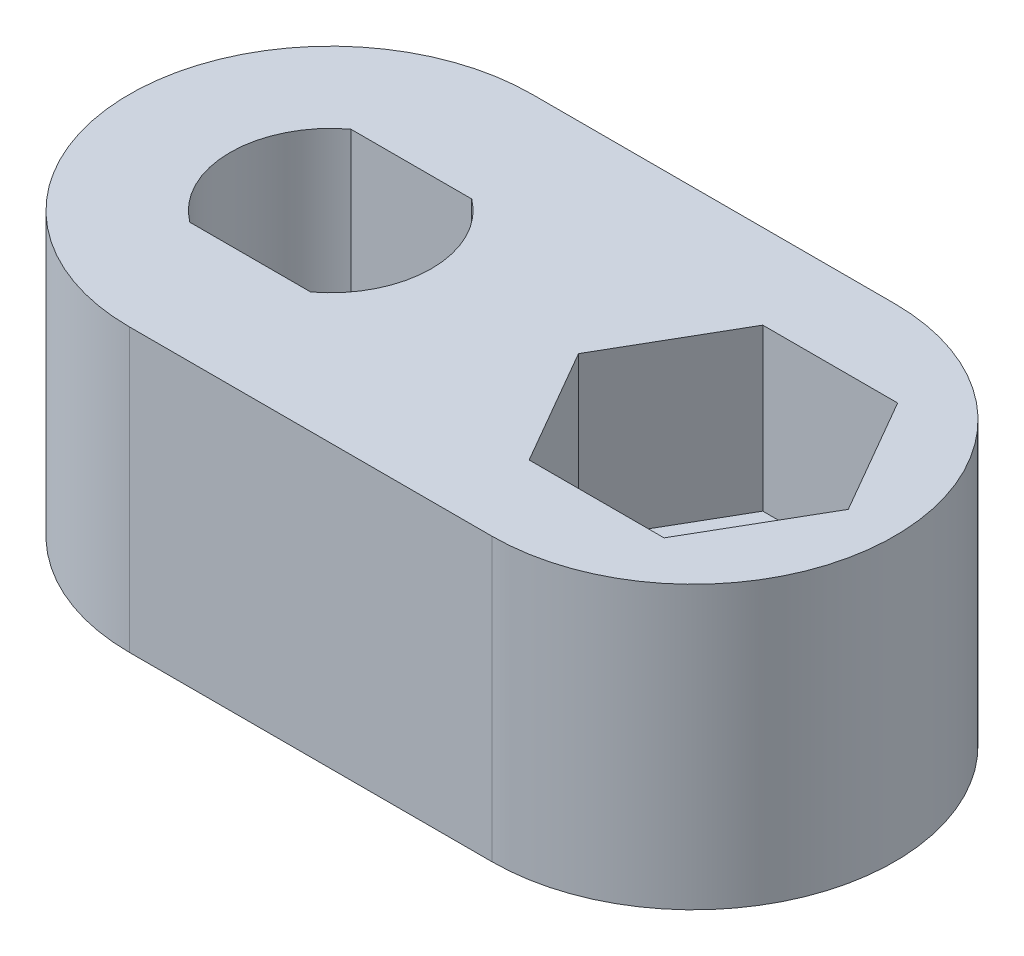
ISO-10303-21;
HEADER;
FILE_DESCRIPTION(('STEP AP214'),'2;1');
FILE_NAME('part.step','',(''),(''),'','','');
FILE_SCHEMA(('AUTOMOTIVE_DESIGN { 1 0 10303 214 1 1 1 1 }'));
ENDSEC;
DATA;
#1=APPLICATION_CONTEXT('core data for automotive mechanical design processes');
#2=APPLICATION_PROTOCOL_DEFINITION('international standard','automotive_design',2000,#1);
#3=PRODUCT_CONTEXT('',#1,'mechanical');
#4=PRODUCT('Part','Part','',(#3));
#5=PRODUCT_RELATED_PRODUCT_CATEGORY('part','',(#4));
#6=PRODUCT_DEFINITION_FORMATION('','',#4);
#7=PRODUCT_DEFINITION_CONTEXT('part definition',#1,'design');
#8=PRODUCT_DEFINITION('design','',#6,#7);
#9=PRODUCT_DEFINITION_SHAPE('','',#8);
#10=(LENGTH_UNIT() NAMED_UNIT(*) SI_UNIT(.MILLI.,.METRE.));
#11=(NAMED_UNIT(*) PLANE_ANGLE_UNIT() SI_UNIT($,.RADIAN.));
#12=(NAMED_UNIT(*) SI_UNIT($,.STERADIAN.) SOLID_ANGLE_UNIT());
#13=UNCERTAINTY_MEASURE_WITH_UNIT(LENGTH_MEASURE(1.E-05),#10,'distance_accuracy_value','');
#14=(GEOMETRIC_REPRESENTATION_CONTEXT(3) GLOBAL_UNCERTAINTY_ASSIGNED_CONTEXT((#13)) GLOBAL_UNIT_ASSIGNED_CONTEXT((#10,
#11,#12)) REPRESENTATION_CONTEXT('',''));
#15=CARTESIAN_POINT('',(0.,0.,0.));
#16=DIRECTION('',(0.,0.,1.));
#17=DIRECTION('',(1.,0.,0.));
#18=AXIS2_PLACEMENT_3D('',#15,#16,#17);
#19=CARTESIAN_POINT('',(5.,7.,0.));
#20=DIRECTION('',(0.,1.,0.));
#21=DIRECTION('',(0.,0.,1.));
#22=AXIS2_PLACEMENT_3D('',#19,#20,#21);
#23=CYLINDRICAL_SURFACE('',#22,2.07500000000001);
#24=CARTESIAN_POINT('',(5.,0.,0.));
#25=DIRECTION('',(0.,1.,0.));
#26=DIRECTION('',(0.,0.,1.));
#27=AXIS2_PLACEMENT_3D('',#24,#25,#26);
#28=CIRCLE('',#27,2.07500000000001);
#29=CARTESIAN_POINT('',(5.,0.,2.07500000000001));
#30=VERTEX_POINT('',#29);
#31=EDGE_CURVE('E216',#30,#30,#28,.T.);
#32=ORIENTED_EDGE('',*,*,#31,.F.);
#33=EDGE_LOOP('',(#32));
#34=FACE_BOUND('',#33,.T.);
#35=CARTESIAN_POINT('',(5.,3.,0.));
#36=DIRECTION('',(0.,1.,0.));
#37=DIRECTION('',(0.,0.,1.));
#38=AXIS2_PLACEMENT_3D('',#35,#36,#37);
#39=CIRCLE('',#38,2.07500000000001);
#40=CARTESIAN_POINT('',(5.,3.,2.07500000000001));
#41=VERTEX_POINT('',#40);
#42=EDGE_CURVE('E43',#41,#41,#39,.F.);
#43=ORIENTED_EDGE('',*,*,#42,.F.);
#44=EDGE_LOOP('',(#43));
#45=FACE_BOUND('',#44,.T.);
#46=ADVANCED_FACE('F39',(#34,#45),#23,.F.);
#47=CARTESIAN_POINT('',(-4.5,7.,0.));
#48=DIRECTION('',(0.,-1.,0.));
#49=DIRECTION('',(0.,0.,-1.));
#50=AXIS2_PLACEMENT_3D('',#47,#48,#49);
#51=CYLINDRICAL_SURFACE('',#50,5.);
#52=CARTESIAN_POINT('',(-4.5,0.,0.));
#53=DIRECTION('',(0.,1.,0.));
#54=DIRECTION('',(0.,0.,1.));
#55=AXIS2_PLACEMENT_3D('',#52,#53,#54);
#56=CIRCLE('',#55,5.);
#57=CARTESIAN_POINT('',(-4.5,0.,-5.));
#58=VERTEX_POINT('',#57);
#59=CARTESIAN_POINT('',(-4.5,0.,5.));
#60=VERTEX_POINT('',#59);
#61=EDGE_CURVE('E256',#58,#60,#56,.T.);
#62=ORIENTED_EDGE('',*,*,#61,.T.);
#63=DIRECTION('',(0.,-1.,0.));
#64=VECTOR('',#63,1.);
#65=CARTESIAN_POINT('',(-4.5,7.,5.));
#66=LINE('',#65,#64);
#67=CARTESIAN_POINT('',(-4.5,7.,5.));
#68=VERTEX_POINT('',#67);
#69=EDGE_CURVE('E11',#68,#60,#66,.T.);
#70=ORIENTED_EDGE('',*,*,#69,.F.);
#71=CARTESIAN_POINT('',(-4.5,7.,0.));
#72=DIRECTION('',(0.,1.,0.));
#73=DIRECTION('',(0.,0.,1.));
#74=AXIS2_PLACEMENT_3D('',#71,#72,#73);
#75=CIRCLE('',#74,5.);
#76=CARTESIAN_POINT('',(-4.5,7.,-5.));
#77=VERTEX_POINT('',#76);
#78=EDGE_CURVE('E265',#77,#68,#75,.T.);
#79=ORIENTED_EDGE('',*,*,#78,.F.);
#80=DIRECTION('',(0.,-1.,0.));
#81=VECTOR('',#80,1.);
#82=CARTESIAN_POINT('',(-4.5,7.,-5.));
#83=LINE('',#82,#81);
#84=EDGE_CURVE('E279',#77,#58,#83,.T.);
#85=ORIENTED_EDGE('',*,*,#84,.T.);
#86=EDGE_LOOP('',(#62,#70,#79,#85));
#87=FACE_BOUND('',#86,.T.);
#88=ADVANCED_FACE('F41',(#87),#51,.T.);
#89=CARTESIAN_POINT('',(-4.5,7.,5.));
#90=DIRECTION('',(0.,0.,-1.));
#91=DIRECTION('',(-1.,0.,0.));
#92=AXIS2_PLACEMENT_3D('',#89,#90,#91);
#93=PLANE('',#92);
#94=DIRECTION('',(1.,0.,0.));
#95=VECTOR('',#94,1.);
#96=CARTESIAN_POINT('',(-4.5,0.,5.));
#97=LINE('',#96,#95);
#98=CARTESIAN_POINT('',(4.5,0.,5.));
#99=VERTEX_POINT('',#98);
#100=EDGE_CURVE('E283',#60,#99,#97,.T.);
#101=ORIENTED_EDGE('',*,*,#100,.T.);
#102=DIRECTION('',(0.,-1.,0.));
#103=VECTOR('',#102,1.);
#104=CARTESIAN_POINT('',(4.5,7.,5.));
#105=LINE('',#104,#103);
#106=CARTESIAN_POINT('',(4.5,7.,5.));
#107=VERTEX_POINT('',#106);
#108=EDGE_CURVE('E49',#107,#99,#105,.T.);
#109=ORIENTED_EDGE('',*,*,#108,.F.);
#110=DIRECTION('',(1.,0.,0.));
#111=VECTOR('',#110,1.);
#112=CARTESIAN_POINT('',(-4.5,7.,5.));
#113=LINE('',#112,#111);
#114=EDGE_CURVE('E269',#68,#107,#113,.T.);
#115=ORIENTED_EDGE('',*,*,#114,.F.);
#116=ORIENTED_EDGE('',*,*,#69,.T.);
#117=EDGE_LOOP('',(#101,#109,#115,#116));
#118=FACE_BOUND('',#117,.T.);
#119=ADVANCED_FACE('F347',(#118),#93,.F.);
#120=CARTESIAN_POINT('',(4.5,7.,0.));
#121=DIRECTION('',(0.,-1.,0.));
#122=DIRECTION('',(0.,0.,-1.));
#123=AXIS2_PLACEMENT_3D('',#120,#121,#122);
#124=CYLINDRICAL_SURFACE('',#123,5.);
#125=CARTESIAN_POINT('',(4.5,0.,0.));
#126=DIRECTION('',(0.,1.,0.));
#127=DIRECTION('',(0.,0.,1.));
#128=AXIS2_PLACEMENT_3D('',#125,#126,#127);
#129=CIRCLE('',#128,5.);
#130=CARTESIAN_POINT('',(4.5,0.,-5.));
#131=VERTEX_POINT('',#130);
#132=EDGE_CURVE('E286',#99,#131,#129,.T.);
#133=ORIENTED_EDGE('',*,*,#132,.T.);
#134=DIRECTION('',(0.,-1.,0.));
#135=VECTOR('',#134,1.);
#136=CARTESIAN_POINT('',(4.5,7.,-5.));
#137=LINE('',#136,#135);
#138=CARTESIAN_POINT('',(4.5,7.,-5.));
#139=VERTEX_POINT('',#138);
#140=EDGE_CURVE('E294',#139,#131,#137,.T.);
#141=ORIENTED_EDGE('',*,*,#140,.F.);
#142=CARTESIAN_POINT('',(4.5,7.,0.));
#143=DIRECTION('',(0.,1.,0.));
#144=DIRECTION('',(0.,0.,1.));
#145=AXIS2_PLACEMENT_3D('',#142,#143,#144);
#146=CIRCLE('',#145,5.);
#147=EDGE_CURVE('E273',#107,#139,#146,.T.);
#148=ORIENTED_EDGE('',*,*,#147,.F.);
#149=ORIENTED_EDGE('',*,*,#108,.T.);
#150=EDGE_LOOP('',(#133,#141,#148,#149));
#151=FACE_BOUND('',#150,.T.);
#152=ADVANCED_FACE('F480',(#151),#124,.T.);
#153=CARTESIAN_POINT('',(-4.5,7.,-5.));
#154=DIRECTION('',(0.,0.,1.));
#155=DIRECTION('',(1.,0.,0.));
#156=AXIS2_PLACEMENT_3D('',#153,#154,#155);
#157=PLANE('',#156);
#158=DIRECTION('',(-1.,0.,0.));
#159=VECTOR('',#158,1.);
#160=CARTESIAN_POINT('',(-4.5,0.,-5.));
#161=LINE('',#160,#159);
#162=EDGE_CURVE('E270',#131,#58,#161,.T.);
#163=ORIENTED_EDGE('',*,*,#162,.T.);
#164=ORIENTED_EDGE('',*,*,#84,.F.);
#165=DIRECTION('',(-1.,0.,0.));
#166=VECTOR('',#165,1.);
#167=CARTESIAN_POINT('',(-4.5,7.,-5.));
#168=LINE('',#167,#166);
#169=EDGE_CURVE('E276',#139,#77,#168,.T.);
#170=ORIENTED_EDGE('',*,*,#169,.F.);
#171=ORIENTED_EDGE('',*,*,#140,.T.);
#172=EDGE_LOOP('',(#163,#164,#170,#171));
#173=FACE_BOUND('',#172,.T.);
#174=ADVANCED_FACE('F475',(#173),#157,.F.);
#175=CARTESIAN_POINT('',(-4.5,7.,0.));
#176=DIRECTION('',(0.,1.,0.));
#177=DIRECTION('',(0.,0.,1.));
#178=AXIS2_PLACEMENT_3D('',#175,#176,#177);
#179=PLANE('',#178);
#180=DIRECTION('',(0.5,0.,-0.866025403784439));
#181=VECTOR('',#180,1.);
#182=CARTESIAN_POINT('',(6.67431578064991,7.,2.89999999999999));
#183=LINE('',#182,#181);
#184=CARTESIAN_POINT('',(6.67431578064991,7.,2.89999999999999));
#185=VERTEX_POINT('',#184);
#186=CARTESIAN_POINT('',(8.34863156129982,7.,0.));
#187=VERTEX_POINT('',#186);
#188=EDGE_CURVE('E57',#185,#187,#183,.T.);
#189=ORIENTED_EDGE('',*,*,#188,.F.);
#190=DIRECTION('',(1.,0.,0.));
#191=VECTOR('',#190,1.);
#192=CARTESIAN_POINT('',(3.32568421935009,7.,2.89999999999999));
#193=LINE('',#192,#191);
#194=CARTESIAN_POINT('',(3.32568421935009,7.,2.89999999999999));
#195=VERTEX_POINT('',#194);
#196=EDGE_CURVE('E168',#195,#185,#193,.T.);
#197=ORIENTED_EDGE('',*,*,#196,.F.);
#198=DIRECTION('',(0.5,0.,0.866025403784439));
#199=VECTOR('',#198,1.);
#200=CARTESIAN_POINT('',(1.65136843870018,7.,0.));
#201=LINE('',#200,#199);
#202=CARTESIAN_POINT('',(1.65136843870018,7.,0.));
#203=VERTEX_POINT('',#202);
#204=EDGE_CURVE('E172',#203,#195,#201,.T.);
#205=ORIENTED_EDGE('',*,*,#204,.F.);
#206=DIRECTION('',(-0.5,0.,0.866025403784439));
#207=VECTOR('',#206,1.);
#208=CARTESIAN_POINT('',(3.32568421935009,7.,-2.89999999999999));
#209=LINE('',#208,#207);
#210=CARTESIAN_POINT('',(3.32568421935009,7.,-2.89999999999999));
#211=VERTEX_POINT('',#210);
#212=EDGE_CURVE('E195',#211,#203,#209,.T.);
#213=ORIENTED_EDGE('',*,*,#212,.F.);
#214=DIRECTION('',(-1.,0.,0.));
#215=VECTOR('',#214,1.);
#216=CARTESIAN_POINT('',(6.67431578064991,7.,-2.89999999999999));
#217=LINE('',#216,#215);
#218=CARTESIAN_POINT('',(6.67431578064991,7.,-2.89999999999999));
#219=VERTEX_POINT('',#218);
#220=EDGE_CURVE('E191',#219,#211,#217,.T.);
#221=ORIENTED_EDGE('',*,*,#220,.F.);
#222=DIRECTION('',(-0.5,0.,-0.866025403784438));
#223=VECTOR('',#222,1.);
#224=CARTESIAN_POINT('',(8.34863156129982,7.,0.));
#225=LINE('',#224,#223);
#226=EDGE_CURVE('E188',#187,#219,#225,.T.);
#227=ORIENTED_EDGE('',*,*,#226,.F.);
#228=EDGE_LOOP('',(#189,#197,#205,#213,#221,#227));
#229=FACE_BOUND('',#228,.T.);
#230=CARTESIAN_POINT('',(-4.5,7.,0.));
#231=DIRECTION('',(0.,1.,0.));
#232=DIRECTION('',(0.,0.,1.));
#233=AXIS2_PLACEMENT_3D('',#230,#231,#232);
#234=CIRCLE('',#233,2.5);
#235=CARTESIAN_POINT('',(-6.,7.,-2.));
#236=VERTEX_POINT('',#235);
#237=CARTESIAN_POINT('',(-6.,7.,2.));
#238=VERTEX_POINT('',#237);
#239=EDGE_CURVE('E65',#236,#238,#234,.T.);
#240=ORIENTED_EDGE('',*,*,#239,.F.);
#241=DIRECTION('',(1.,0.,0.));
#242=VECTOR('',#241,1.);
#243=CARTESIAN_POINT('',(0.,7.,-2.));
#244=LINE('',#243,#242);
#245=CARTESIAN_POINT('',(-3.,7.,-2.));
#246=VERTEX_POINT('',#245);
#247=EDGE_CURVE('E234',#236,#246,#244,.T.);
#248=ORIENTED_EDGE('',*,*,#247,.T.);
#249=CARTESIAN_POINT('',(-3.,7.,2.));
#250=VERTEX_POINT('',#249);
#251=EDGE_CURVE('E246',#250,#246,#234,.T.);
#252=ORIENTED_EDGE('',*,*,#251,.F.);
#253=DIRECTION('',(1.,0.,0.));
#254=VECTOR('',#253,1.);
#255=CARTESIAN_POINT('',(0.,7.,2.));
#256=LINE('',#255,#254);
#257=EDGE_CURVE('E245',#238,#250,#256,.T.);
#258=ORIENTED_EDGE('',*,*,#257,.F.);
#259=EDGE_LOOP('',(#240,#248,#252,#258));
#260=FACE_BOUND('',#259,.T.);
#261=ORIENTED_EDGE('',*,*,#78,.T.);
#262=ORIENTED_EDGE('',*,*,#114,.T.);
#263=ORIENTED_EDGE('',*,*,#147,.T.);
#264=ORIENTED_EDGE('',*,*,#169,.T.);
#265=EDGE_LOOP('',(#261,#262,#263,#264));
#266=FACE_BOUND('',#265,.T.);
#267=ADVANCED_FACE('F329',(#229,#260,#266),#179,.T.);
#268=CARTESIAN_POINT('',(-4.5,0.,0.));
#269=DIRECTION('',(0.,1.,0.));
#270=DIRECTION('',(0.,0.,1.));
#271=AXIS2_PLACEMENT_3D('',#268,#269,#270);
#272=PLANE('',#271);
#273=ORIENTED_EDGE('',*,*,#31,.T.);
#274=EDGE_LOOP('',(#273));
#275=FACE_BOUND('',#274,.T.);
#276=CARTESIAN_POINT('',(-4.5,0.,0.));
#277=DIRECTION('',(0.,-1.,0.));
#278=DIRECTION('',(0.,0.,-1.));
#279=AXIS2_PLACEMENT_3D('',#276,#277,#278);
#280=CIRCLE('',#279,3.36);
#281=CARTESIAN_POINT('',(-4.5,0.,-3.36));
#282=VERTEX_POINT('',#281);
#283=EDGE_CURVE('E220',#282,#282,#280,.T.);
#284=ORIENTED_EDGE('',*,*,#283,.F.);
#285=EDGE_LOOP('',(#284));
#286=FACE_BOUND('',#285,.T.);
#287=ORIENTED_EDGE('',*,*,#61,.F.);
#288=ORIENTED_EDGE('',*,*,#162,.F.);
#289=ORIENTED_EDGE('',*,*,#132,.F.);
#290=ORIENTED_EDGE('',*,*,#100,.F.);
#291=EDGE_LOOP('',(#287,#288,#289,#290));
#292=FACE_BOUND('',#291,.T.);
#293=ADVANCED_FACE('F340',(#275,#286,#292),#272,.F.);
#294=CARTESIAN_POINT('',(-4.5,3.,0.));
#295=DIRECTION('',(0.,1.,0.));
#296=DIRECTION('',(0.,0.,1.));
#297=AXIS2_PLACEMENT_3D('',#294,#295,#296);
#298=CYLINDRICAL_SURFACE('',#297,2.5);
#299=ORIENTED_EDGE('',*,*,#239,.T.);
#300=DIRECTION('',(0.,1.,0.));
#301=VECTOR('',#300,1.);
#302=CARTESIAN_POINT('',(-6.,3.,2.));
#303=LINE('',#302,#301);
#304=CARTESIAN_POINT('',(-6.,3.,2.));
#305=VERTEX_POINT('',#304);
#306=EDGE_CURVE('E242',#305,#238,#303,.T.);
#307=ORIENTED_EDGE('',*,*,#306,.F.);
#308=CARTESIAN_POINT('',(-4.5,3.,0.));
#309=DIRECTION('',(0.,1.,0.));
#310=DIRECTION('',(0.,0.,1.));
#311=AXIS2_PLACEMENT_3D('',#308,#309,#310);
#312=CIRCLE('',#311,2.5);
#313=CARTESIAN_POINT('',(-6.,3.,-2.));
#314=VERTEX_POINT('',#313);
#315=EDGE_CURVE('E229',#314,#305,#312,.T.);
#316=ORIENTED_EDGE('',*,*,#315,.F.);
#317=DIRECTION('',(0.,1.,0.));
#318=VECTOR('',#317,1.);
#319=CARTESIAN_POINT('',(-6.,3.,-2.));
#320=LINE('',#319,#318);
#321=EDGE_CURVE('E253',#314,#236,#320,.T.);
#322=ORIENTED_EDGE('',*,*,#321,.T.);
#323=EDGE_LOOP('',(#299,#307,#316,#322));
#324=FACE_BOUND('',#323,.T.);
#325=ADVANCED_FACE('F316',(#324),#298,.F.);
#326=CARTESIAN_POINT('',(0.,3.,-2.));
#327=DIRECTION('',(0.,0.,1.));
#328=DIRECTION('',(1.,0.,0.));
#329=AXIS2_PLACEMENT_3D('',#326,#327,#328);
#330=PLANE('',#329);
#331=ORIENTED_EDGE('',*,*,#247,.F.);
#332=ORIENTED_EDGE('',*,*,#321,.F.);
#333=DIRECTION('',(1.,0.,0.));
#334=VECTOR('',#333,1.);
#335=CARTESIAN_POINT('',(0.,3.,-2.));
#336=LINE('',#335,#334);
#337=CARTESIAN_POINT('',(-3.,3.,-2.));
#338=VERTEX_POINT('',#337);
#339=EDGE_CURVE('E239',#314,#338,#336,.T.);
#340=ORIENTED_EDGE('',*,*,#339,.T.);
#341=DIRECTION('',(0.,1.,0.));
#342=VECTOR('',#341,1.);
#343=CARTESIAN_POINT('',(-3.,3.,-2.));
#344=LINE('',#343,#342);
#345=EDGE_CURVE('E257',#338,#246,#344,.T.);
#346=ORIENTED_EDGE('',*,*,#345,.T.);
#347=EDGE_LOOP('',(#331,#332,#340,#346));
#348=FACE_BOUND('',#347,.T.);
#349=ADVANCED_FACE('F332',(#348),#330,.T.);
#350=ORIENTED_EDGE('',*,*,#251,.T.);
#351=ORIENTED_EDGE('',*,*,#345,.F.);
#352=CARTESIAN_POINT('',(-3.,3.,2.));
#353=VERTEX_POINT('',#352);
#354=EDGE_CURVE('E235',#353,#338,#312,.T.);
#355=ORIENTED_EDGE('',*,*,#354,.F.);
#356=DIRECTION('',(0.,1.,0.));
#357=VECTOR('',#356,1.);
#358=CARTESIAN_POINT('',(-3.,3.,2.));
#359=LINE('',#358,#357);
#360=EDGE_CURVE('E260',#353,#250,#359,.T.);
#361=ORIENTED_EDGE('',*,*,#360,.T.);
#362=EDGE_LOOP('',(#350,#351,#355,#361));
#363=FACE_BOUND('',#362,.T.);
#364=ADVANCED_FACE('F325',(#363),#298,.F.);
#365=CARTESIAN_POINT('',(0.,3.,2.));
#366=DIRECTION('',(0.,0.,1.));
#367=DIRECTION('',(1.,0.,0.));
#368=AXIS2_PLACEMENT_3D('',#365,#366,#367);
#369=PLANE('',#368);
#370=ORIENTED_EDGE('',*,*,#257,.T.);
#371=ORIENTED_EDGE('',*,*,#360,.F.);
#372=DIRECTION('',(1.,0.,0.));
#373=VECTOR('',#372,1.);
#374=CARTESIAN_POINT('',(0.,3.,2.));
#375=LINE('',#374,#373);
#376=EDGE_CURVE('E233',#305,#353,#375,.T.);
#377=ORIENTED_EDGE('',*,*,#376,.F.);
#378=ORIENTED_EDGE('',*,*,#306,.T.);
#379=EDGE_LOOP('',(#370,#371,#377,#378));
#380=FACE_BOUND('',#379,.T.);
#381=ADVANCED_FACE('F310',(#380),#369,.F.);
#382=CARTESIAN_POINT('',(0.,3.,0.));
#383=DIRECTION('',(0.,1.,0.));
#384=DIRECTION('',(0.,0.,1.));
#385=AXIS2_PLACEMENT_3D('',#382,#383,#384);
#386=PLANE('',#385);
#387=CARTESIAN_POINT('',(-4.5,3.,0.));
#388=DIRECTION('',(0.,1.,0.));
#389=DIRECTION('',(0.,0.,1.));
#390=AXIS2_PLACEMENT_3D('',#387,#388,#389);
#391=CIRCLE('',#390,1.7);
#392=CARTESIAN_POINT('',(-4.5,3.,1.7));
#393=VERTEX_POINT('',#392);
#394=EDGE_CURVE('E228',#393,#393,#391,.T.);
#395=ORIENTED_EDGE('',*,*,#394,.F.);
#396=EDGE_LOOP('',(#395));
#397=FACE_BOUND('',#396,.T.);
#398=ORIENTED_EDGE('',*,*,#315,.T.);
#399=ORIENTED_EDGE('',*,*,#376,.T.);
#400=ORIENTED_EDGE('',*,*,#354,.T.);
#401=ORIENTED_EDGE('',*,*,#339,.F.);
#402=EDGE_LOOP('',(#398,#399,#400,#401));
#403=FACE_BOUND('',#402,.T.);
#404=ADVANCED_FACE('F307',(#397,#403),#386,.T.);
#405=CARTESIAN_POINT('',(-4.5,0.,0.));
#406=DIRECTION('',(0.,-1.,0.));
#407=DIRECTION('',(0.,0.,-1.));
#408=AXIS2_PLACEMENT_3D('',#405,#406,#407);
#409=CYLINDRICAL_SURFACE('',#408,1.7);
#410=ORIENTED_EDGE('',*,*,#394,.T.);
#411=EDGE_LOOP('',(#410));
#412=FACE_BOUND('',#411,.T.);
#413=CARTESIAN_POINT('',(-4.5,1.66,0.));
#414=DIRECTION('',(0.,-1.,0.));
#415=DIRECTION('',(0.,0.,-1.));
#416=AXIS2_PLACEMENT_3D('',#413,#414,#415);
#417=CIRCLE('',#416,1.7);
#418=CARTESIAN_POINT('',(-4.5,1.66,-1.7));
#419=VERTEX_POINT('',#418);
#420=EDGE_CURVE('E224',#419,#419,#417,.T.);
#421=ORIENTED_EDGE('',*,*,#420,.T.);
#422=EDGE_LOOP('',(#421));
#423=FACE_BOUND('',#422,.T.);
#424=ADVANCED_FACE('F304',(#412,#423),#409,.F.);
#425=CARTESIAN_POINT('',(-4.5,0.,0.));
#426=DIRECTION('',(0.,-1.,0.));
#427=DIRECTION('',(0.,0.,-1.));
#428=AXIS2_PLACEMENT_3D('',#425,#426,#427);
#429=CONICAL_SURFACE('',#428,3.36,0.785398163397448);
#430=ORIENTED_EDGE('',*,*,#420,.F.);
#431=EDGE_LOOP('',(#430));
#432=FACE_BOUND('',#431,.T.);
#433=ORIENTED_EDGE('',*,*,#283,.T.);
#434=EDGE_LOOP('',(#433));
#435=FACE_BOUND('',#434,.T.);
#436=ADVANCED_FACE('F354',(#432,#435),#429,.F.);
#437=CARTESIAN_POINT('',(0.,3.,0.));
#438=DIRECTION('',(0.,1.,0.));
#439=DIRECTION('',(0.,0.,1.));
#440=AXIS2_PLACEMENT_3D('',#437,#438,#439);
#441=PLANE('',#440);
#442=DIRECTION('',(0.5,0.,-0.866025403784439));
#443=VECTOR('',#442,1.);
#444=CARTESIAN_POINT('',(6.67431578064991,3.,2.89999999999999));
#445=LINE('',#444,#443);
#446=CARTESIAN_POINT('',(6.67431578064991,3.,2.89999999999999));
#447=VERTEX_POINT('',#446);
#448=CARTESIAN_POINT('',(8.34863156129982,3.,0.));
#449=VERTEX_POINT('',#448);
#450=EDGE_CURVE('E145',#447,#449,#445,.T.);
#451=ORIENTED_EDGE('',*,*,#450,.T.);
#452=DIRECTION('',(-0.5,0.,-0.866025403784438));
#453=VECTOR('',#452,1.);
#454=CARTESIAN_POINT('',(8.34863156129982,3.,0.));
#455=LINE('',#454,#453);
#456=CARTESIAN_POINT('',(6.67431578064991,3.,-2.89999999999999));
#457=VERTEX_POINT('',#456);
#458=EDGE_CURVE('E155',#449,#457,#455,.T.);
#459=ORIENTED_EDGE('',*,*,#458,.T.);
#460=DIRECTION('',(-1.,0.,0.));
#461=VECTOR('',#460,1.);
#462=CARTESIAN_POINT('',(6.67431578064991,3.,-2.89999999999999));
#463=LINE('',#462,#461);
#464=CARTESIAN_POINT('',(3.32568421935009,3.,-2.89999999999999));
#465=VERTEX_POINT('',#464);
#466=EDGE_CURVE('E161',#457,#465,#463,.T.);
#467=ORIENTED_EDGE('',*,*,#466,.T.);
#468=DIRECTION('',(-0.5,0.,0.866025403784439));
#469=VECTOR('',#468,1.);
#470=CARTESIAN_POINT('',(3.32568421935009,3.,-2.89999999999999));
#471=LINE('',#470,#469);
#472=CARTESIAN_POINT('',(1.65136843870018,3.,0.));
#473=VERTEX_POINT('',#472);
#474=EDGE_CURVE('E177',#465,#473,#471,.T.);
#475=ORIENTED_EDGE('',*,*,#474,.T.);
#476=DIRECTION('',(0.5,0.,0.866025403784439));
#477=VECTOR('',#476,1.);
#478=CARTESIAN_POINT('',(1.65136843870018,3.,0.));
#479=LINE('',#478,#477);
#480=CARTESIAN_POINT('',(3.32568421935009,3.,2.89999999999999));
#481=VERTEX_POINT('',#480);
#482=EDGE_CURVE('E181',#473,#481,#479,.T.);
#483=ORIENTED_EDGE('',*,*,#482,.T.);
#484=DIRECTION('',(1.,0.,0.));
#485=VECTOR('',#484,1.);
#486=CARTESIAN_POINT('',(3.32568421935009,3.,2.89999999999999));
#487=LINE('',#486,#485);
#488=EDGE_CURVE('E152',#481,#447,#487,.T.);
#489=ORIENTED_EDGE('',*,*,#488,.T.);
#490=EDGE_LOOP('',(#451,#459,#467,#475,#483,#489));
#491=FACE_BOUND('',#490,.T.);
#492=ORIENTED_EDGE('',*,*,#42,.T.);
#493=EDGE_LOOP('',(#492));
#494=FACE_BOUND('',#493,.T.);
#495=ADVANCED_FACE('F163',(#491,#494),#441,.T.);
#496=CARTESIAN_POINT('',(6.67431578064991,3.,2.89999999999999));
#497=DIRECTION('',(0.866025403784439,0.,0.5));
#498=DIRECTION('',(0.5,0.,-0.866025403784439));
#499=AXIS2_PLACEMENT_3D('',#496,#497,#498);
#500=PLANE('',#499);
#501=ORIENTED_EDGE('',*,*,#188,.T.);
#502=DIRECTION('',(0.,1.,0.));
#503=VECTOR('',#502,1.);
#504=CARTESIAN_POINT('',(8.34863156129982,3.,0.));
#505=LINE('',#504,#503);
#506=EDGE_CURVE('E141',#449,#187,#505,.T.);
#507=ORIENTED_EDGE('',*,*,#506,.F.);
#508=ORIENTED_EDGE('',*,*,#450,.F.);
#509=DIRECTION('',(0.,1.,0.));
#510=VECTOR('',#509,1.);
#511=CARTESIAN_POINT('',(6.67431578064991,3.,2.89999999999999));
#512=LINE('',#511,#510);
#513=EDGE_CURVE('E202',#447,#185,#512,.T.);
#514=ORIENTED_EDGE('',*,*,#513,.T.);
#515=EDGE_LOOP('',(#501,#507,#508,#514));
#516=FACE_BOUND('',#515,.T.);
#517=ADVANCED_FACE('F143',(#516),#500,.F.);
#518=CARTESIAN_POINT('',(3.32568421935009,3.,2.89999999999999));
#519=DIRECTION('',(0.,0.,1.));
#520=DIRECTION('',(1.,0.,0.));
#521=AXIS2_PLACEMENT_3D('',#518,#519,#520);
#522=PLANE('',#521);
#523=ORIENTED_EDGE('',*,*,#196,.T.);
#524=ORIENTED_EDGE('',*,*,#513,.F.);
#525=ORIENTED_EDGE('',*,*,#488,.F.);
#526=DIRECTION('',(0.,1.,0.));
#527=VECTOR('',#526,1.);
#528=CARTESIAN_POINT('',(3.32568421935009,3.,2.89999999999999));
#529=LINE('',#528,#527);
#530=EDGE_CURVE('E205',#481,#195,#529,.T.);
#531=ORIENTED_EDGE('',*,*,#530,.T.);
#532=EDGE_LOOP('',(#523,#524,#525,#531));
#533=FACE_BOUND('',#532,.T.);
#534=ADVANCED_FACE('F382',(#533),#522,.F.);
#535=CARTESIAN_POINT('',(1.65136843870018,3.,0.));
#536=DIRECTION('',(-0.866025403784439,0.,0.5));
#537=DIRECTION('',(0.5,0.,0.866025403784439));
#538=AXIS2_PLACEMENT_3D('',#535,#536,#537);
#539=PLANE('',#538);
#540=ORIENTED_EDGE('',*,*,#204,.T.);
#541=ORIENTED_EDGE('',*,*,#530,.F.);
#542=ORIENTED_EDGE('',*,*,#482,.F.);
#543=DIRECTION('',(0.,1.,0.));
#544=VECTOR('',#543,1.);
#545=CARTESIAN_POINT('',(1.65136843870018,3.,0.));
#546=LINE('',#545,#544);
#547=EDGE_CURVE('E208',#473,#203,#546,.T.);
#548=ORIENTED_EDGE('',*,*,#547,.T.);
#549=EDGE_LOOP('',(#540,#541,#542,#548));
#550=FACE_BOUND('',#549,.T.);
#551=ADVANCED_FACE('F388',(#550),#539,.F.);
#552=CARTESIAN_POINT('',(3.32568421935009,3.,-2.89999999999999));
#553=DIRECTION('',(-0.866025403784439,0.,-0.5));
#554=DIRECTION('',(-0.5,0.,0.866025403784439));
#555=AXIS2_PLACEMENT_3D('',#552,#553,#554);
#556=PLANE('',#555);
#557=ORIENTED_EDGE('',*,*,#212,.T.);
#558=ORIENTED_EDGE('',*,*,#547,.F.);
#559=ORIENTED_EDGE('',*,*,#474,.F.);
#560=DIRECTION('',(0.,1.,0.));
#561=VECTOR('',#560,1.);
#562=CARTESIAN_POINT('',(3.32568421935009,3.,-2.89999999999999));
#563=LINE('',#562,#561);
#564=EDGE_CURVE('E211',#465,#211,#563,.T.);
#565=ORIENTED_EDGE('',*,*,#564,.T.);
#566=EDGE_LOOP('',(#557,#558,#559,#565));
#567=FACE_BOUND('',#566,.T.);
#568=ADVANCED_FACE('F396',(#567),#556,.F.);
#569=CARTESIAN_POINT('',(6.67431578064991,3.,-2.89999999999999));
#570=DIRECTION('',(0.,0.,-1.));
#571=DIRECTION('',(-1.,0.,0.));
#572=AXIS2_PLACEMENT_3D('',#569,#570,#571);
#573=PLANE('',#572);
#574=ORIENTED_EDGE('',*,*,#220,.T.);
#575=ORIENTED_EDGE('',*,*,#564,.F.);
#576=ORIENTED_EDGE('',*,*,#466,.F.);
#577=DIRECTION('',(0.,1.,0.));
#578=VECTOR('',#577,1.);
#579=CARTESIAN_POINT('',(6.67431578064991,3.,-2.89999999999999));
#580=LINE('',#579,#578);
#581=EDGE_CURVE('E151',#457,#219,#580,.T.);
#582=ORIENTED_EDGE('',*,*,#581,.T.);
#583=EDGE_LOOP('',(#574,#575,#576,#582));
#584=FACE_BOUND('',#583,.T.);
#585=ADVANCED_FACE('F404',(#584),#573,.F.);
#586=CARTESIAN_POINT('',(8.34863156129982,3.,0.));
#587=DIRECTION('',(0.866025403784438,0.,-0.5));
#588=DIRECTION('',(-0.5,0.,-0.866025403784438));
#589=AXIS2_PLACEMENT_3D('',#586,#587,#588);
#590=PLANE('',#589);
#591=ORIENTED_EDGE('',*,*,#226,.T.);
#592=ORIENTED_EDGE('',*,*,#581,.F.);
#593=ORIENTED_EDGE('',*,*,#458,.F.);
#594=ORIENTED_EDGE('',*,*,#506,.T.);
#595=EDGE_LOOP('',(#591,#592,#593,#594));
#596=FACE_BOUND('',#595,.T.);
#597=ADVANCED_FACE('F156',(#596),#590,.F.);
#598=CLOSED_SHELL('',(#46,#88,#119,#152,#174,#267,#293,#325,#349,#364,#381,#404,#424,#436,#495,
#517,#534,#551,#568,#585,#597));
#599=MANIFOLD_SOLID_BREP('B2',#598);
#600=ADVANCED_BREP_SHAPE_REPRESENTATION('',(#18,#599),#14);
#601=SHAPE_DEFINITION_REPRESENTATION(#9,#600);
ENDSEC;
END-ISO-10303-21;
